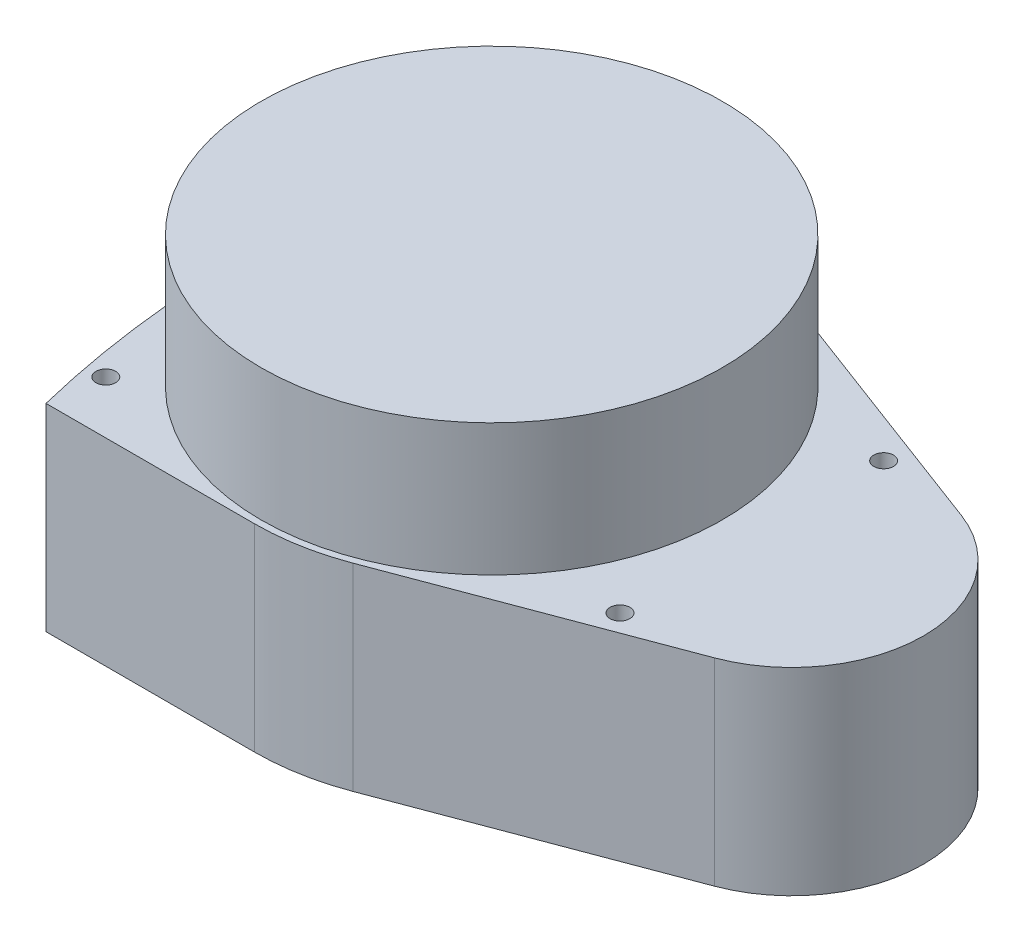
ISO-10303-21;
HEADER;
FILE_DESCRIPTION(('STEP AP214'),'2;1');
FILE_NAME('part.step','',(''),(''),'','','');
FILE_SCHEMA(('AUTOMOTIVE_DESIGN { 1 0 10303 214 1 1 1 1 }'));
ENDSEC;
DATA;
#1=APPLICATION_CONTEXT('core data for automotive mechanical design processes');
#2=APPLICATION_PROTOCOL_DEFINITION('international standard','automotive_design',2000,#1);
#3=PRODUCT_CONTEXT('',#1,'mechanical');
#4=PRODUCT('Part','Part','',(#3));
#5=PRODUCT_RELATED_PRODUCT_CATEGORY('part','',(#4));
#6=PRODUCT_DEFINITION_FORMATION('','',#4);
#7=PRODUCT_DEFINITION_CONTEXT('part definition',#1,'design');
#8=PRODUCT_DEFINITION('design','',#6,#7);
#9=PRODUCT_DEFINITION_SHAPE('','',#8);
#10=(LENGTH_UNIT() NAMED_UNIT(*) SI_UNIT(.MILLI.,.METRE.));
#11=(NAMED_UNIT(*) PLANE_ANGLE_UNIT() SI_UNIT($,.RADIAN.));
#12=(NAMED_UNIT(*) SI_UNIT($,.STERADIAN.) SOLID_ANGLE_UNIT());
#13=UNCERTAINTY_MEASURE_WITH_UNIT(LENGTH_MEASURE(1.E-05),#10,'distance_accuracy_value','');
#14=(GEOMETRIC_REPRESENTATION_CONTEXT(3) GLOBAL_UNCERTAINTY_ASSIGNED_CONTEXT((#13)) GLOBAL_UNIT_ASSIGNED_CONTEXT((#10,
#11,#12)) REPRESENTATION_CONTEXT('',''));
#15=CARTESIAN_POINT('',(0.,0.,0.));
#16=DIRECTION('',(0.,0.,1.));
#17=DIRECTION('',(1.,0.,0.));
#18=AXIS2_PLACEMENT_3D('',#15,#16,#17);
#19=CARTESIAN_POINT('',(0.,20.,0.));
#20=DIRECTION('',(0.,-1.,0.));
#21=DIRECTION('',(0.,0.,-1.));
#22=AXIS2_PLACEMENT_3D('',#19,#20,#21);
#23=CYLINDRICAL_SURFACE('',#22,35.);
#24=CARTESIAN_POINT('',(0.,20.,0.));
#25=DIRECTION('',(0.,1.,0.));
#26=DIRECTION('',(0.,0.,1.));
#27=AXIS2_PLACEMENT_3D('',#24,#25,#26);
#28=CIRCLE('',#27,35.);
#29=CARTESIAN_POINT('',(0.,20.,35.));
#30=VERTEX_POINT('',#29);
#31=EDGE_CURVE('E11',#30,#30,#28,.T.);
#32=ORIENTED_EDGE('',*,*,#31,.F.);
#33=EDGE_LOOP('',(#32));
#34=FACE_BOUND('',#33,.T.);
#35=CARTESIAN_POINT('',(0.,0.,0.));
#36=DIRECTION('',(0.,1.,0.));
#37=DIRECTION('',(0.,0.,1.));
#38=AXIS2_PLACEMENT_3D('',#35,#36,#37);
#39=CIRCLE('',#38,35.);
#40=CARTESIAN_POINT('',(0.,0.,35.));
#41=VERTEX_POINT('',#40);
#42=EDGE_CURVE('E37',#41,#41,#39,.T.);
#43=ORIENTED_EDGE('',*,*,#42,.T.);
#44=EDGE_LOOP('',(#43));
#45=FACE_BOUND('',#44,.T.);
#46=ADVANCED_FACE('F34',(#34,#45),#23,.T.);
#47=CARTESIAN_POINT('',(0.,20.,0.));
#48=DIRECTION('',(0.,1.,0.));
#49=DIRECTION('',(0.,0.,1.));
#50=AXIS2_PLACEMENT_3D('',#47,#48,#49);
#51=PLANE('',#50);
#52=ORIENTED_EDGE('',*,*,#31,.T.);
#53=EDGE_LOOP('',(#52));
#54=FACE_BOUND('',#53,.T.);
#55=ADVANCED_FACE('F229',(#54),#51,.T.);
#56=CARTESIAN_POINT('',(45.5,0.,0.));
#57=DIRECTION('',(0.,1.,0.));
#58=DIRECTION('',(0.,0.,1.));
#59=AXIS2_PLACEMENT_3D('',#56,#57,#58);
#60=PLANE('',#59);
#61=CARTESIAN_POINT('',(39.46,0.,20.));
#62=DIRECTION('',(0.,-1.,0.));
#63=DIRECTION('',(0.,0.,-1.));
#64=AXIS2_PLACEMENT_3D('',#61,#62,#63);
#65=CIRCLE('',#64,1.5);
#66=CARTESIAN_POINT('',(39.46,0.,18.5));
#67=VERTEX_POINT('',#66);
#68=EDGE_CURVE('E203',#67,#67,#65,.T.);
#69=ORIENTED_EDGE('',*,*,#68,.T.);
#70=EDGE_LOOP('',(#69));
#71=FACE_BOUND('',#70,.T.);
#72=CARTESIAN_POINT('',(-30.54,0.,28.));
#73=DIRECTION('',(0.,-1.,0.));
#74=DIRECTION('',(0.,0.,-1.));
#75=AXIS2_PLACEMENT_3D('',#72,#73,#74);
#76=CIRCLE('',#75,1.5);
#77=CARTESIAN_POINT('',(-30.54,0.,26.5));
#78=VERTEX_POINT('',#77);
#79=EDGE_CURVE('E197',#78,#78,#76,.T.);
#80=ORIENTED_EDGE('',*,*,#79,.T.);
#81=EDGE_LOOP('',(#80));
#82=FACE_BOUND('',#81,.T.);
#83=CARTESIAN_POINT('',(39.46,0.,-20.));
#84=DIRECTION('',(0.,1.,0.));
#85=DIRECTION('',(0.,0.,1.));
#86=AXIS2_PLACEMENT_3D('',#83,#84,#85);
#87=CIRCLE('',#86,1.5);
#88=CARTESIAN_POINT('',(39.46,0.,-18.5));
#89=VERTEX_POINT('',#88);
#90=EDGE_CURVE('E191',#89,#89,#87,.T.);
#91=ORIENTED_EDGE('',*,*,#90,.F.);
#92=EDGE_LOOP('',(#91));
#93=FACE_BOUND('',#92,.T.);
#94=CARTESIAN_POINT('',(-30.54,0.,-28.));
#95=DIRECTION('',(0.,1.,0.));
#96=DIRECTION('',(0.,0.,1.));
#97=AXIS2_PLACEMENT_3D('',#94,#95,#96);
#98=CIRCLE('',#97,1.5);
#99=CARTESIAN_POINT('',(-30.54,0.,-26.5));
#100=VERTEX_POINT('',#99);
#101=EDGE_CURVE('E185',#100,#100,#98,.T.);
#102=ORIENTED_EDGE('',*,*,#101,.F.);
#103=EDGE_LOOP('',(#102));
#104=FACE_BOUND('',#103,.T.);
#105=DIRECTION('',(-0.936132168437226,0.,0.351648351648371));
#106=VECTOR('',#105,1.);
#107=CARTESIAN_POINT('',(52.5329670329674,0.,18.7226433687436));
#108=LINE('',#107,#106);
#109=CARTESIAN_POINT('',(52.5329670329674,0.,18.7226433687436));
#110=VERTEX_POINT('',#109);
#111=CARTESIAN_POINT('',(12.6593406593413,0.,33.7007580637401));
#112=VERTEX_POINT('',#111);
#113=EDGE_CURVE('E121',#110,#112,#108,.T.);
#114=ORIENTED_EDGE('',*,*,#113,.F.);
#115=CARTESIAN_POINT('',(45.5,0.,0.));
#116=DIRECTION('',(0.,1.,0.));
#117=DIRECTION('',(0.,0.,1.));
#118=AXIS2_PLACEMENT_3D('',#115,#116,#117);
#119=CIRCLE('',#118,20.);
#120=CARTESIAN_POINT('',(52.532967032967,0.,-18.7226433687447));
#121=VERTEX_POINT('',#120);
#122=EDGE_CURVE('E144',#110,#121,#119,.T.);
#123=ORIENTED_EDGE('',*,*,#122,.T.);
#124=DIRECTION('',(-0.936132168437234,0.,-0.351648351648351));
#125=VECTOR('',#124,1.);
#126=CARTESIAN_POINT('',(52.532967032967,0.,-18.7226433687447));
#127=LINE('',#126,#125);
#128=CARTESIAN_POINT('',(12.6593406593407,0.,-33.7007580637404));
#129=VERTEX_POINT('',#128);
#130=EDGE_CURVE('E147',#121,#129,#127,.T.);
#131=ORIENTED_EDGE('',*,*,#130,.T.);
#132=CARTESIAN_POINT('',(0.,0.,0.));
#133=DIRECTION('',(0.,1.,0.));
#134=DIRECTION('',(0.,0.,1.));
#135=AXIS2_PLACEMENT_3D('',#132,#133,#134);
#136=CIRCLE('',#135,36.);
#137=CARTESIAN_POINT('',(0.,0.,-36.));
#138=VERTEX_POINT('',#137);
#139=EDGE_CURVE('E151',#129,#138,#136,.T.);
#140=ORIENTED_EDGE('',*,*,#139,.T.);
#141=DIRECTION('',(-1.,0.,0.));
#142=VECTOR('',#141,1.);
#143=CARTESIAN_POINT('',(0.,0.,-36.));
#144=LINE('',#143,#142);
#145=CARTESIAN_POINT('',(-31.6159331941392,0.,-36.));
#146=VERTEX_POINT('',#145);
#147=EDGE_CURVE('E154',#138,#146,#144,.T.);
#148=ORIENTED_EDGE('',*,*,#147,.T.);
#149=CARTESIAN_POINT('',(114.,0.,0.));
#150=DIRECTION('',(0.,1.,0.));
#151=DIRECTION('',(0.,0.,1.));
#152=AXIS2_PLACEMENT_3D('',#149,#150,#151);
#153=CIRCLE('',#152,150.);
#154=CARTESIAN_POINT('',(-31.6159331941384,0.,36.0000000000006));
#155=VERTEX_POINT('',#154);
#156=EDGE_CURVE('E139',#146,#155,#153,.T.);
#157=ORIENTED_EDGE('',*,*,#156,.T.);
#158=DIRECTION('',(-1.,0.,0.));
#159=VECTOR('',#158,1.);
#160=CARTESIAN_POINT('',(7.43014747970558E-13,0.,36.));
#161=LINE('',#160,#159);
#162=CARTESIAN_POINT('',(7.47423476447489E-13,0.,36.));
#163=VERTEX_POINT('',#162);
#164=EDGE_CURVE('E126',#163,#155,#161,.T.);
#165=ORIENTED_EDGE('',*,*,#164,.F.);
#166=CARTESIAN_POINT('',(0.,0.,0.));
#167=DIRECTION('',(0.,-1.,0.));
#168=DIRECTION('',(0.,0.,-1.));
#169=AXIS2_PLACEMENT_3D('',#166,#167,#168);
#170=CIRCLE('',#169,36.);
#171=EDGE_CURVE('E172',#112,#163,#170,.T.);
#172=ORIENTED_EDGE('',*,*,#171,.F.);
#173=EDGE_LOOP('',(#114,#123,#131,#140,#148,#157,#165,#172));
#174=FACE_BOUND('',#173,.T.);
#175=ORIENTED_EDGE('',*,*,#42,.F.);
#176=EDGE_LOOP('',(#175));
#177=FACE_BOUND('',#176,.T.);
#178=ADVANCED_FACE('F168',(#71,#82,#93,#104,#174,#177),#60,.T.);
#179=CARTESIAN_POINT('',(45.5,-30.,0.));
#180=DIRECTION('',(0.,1.,0.));
#181=DIRECTION('',(0.,0.,1.));
#182=AXIS2_PLACEMENT_3D('',#179,#180,#181);
#183=CYLINDRICAL_SURFACE('',#182,20.);
#184=ORIENTED_EDGE('',*,*,#122,.F.);
#185=DIRECTION('',(0.,1.,0.));
#186=VECTOR('',#185,1.);
#187=CARTESIAN_POINT('',(52.5329670329674,-30.,18.7226433687436));
#188=LINE('',#187,#186);
#189=CARTESIAN_POINT('',(52.5329670329674,-30.,18.7226433687436));
#190=VERTEX_POINT('',#189);
#191=EDGE_CURVE('E148',#190,#110,#188,.T.);
#192=ORIENTED_EDGE('',*,*,#191,.F.);
#193=CARTESIAN_POINT('',(45.5,-30.,0.));
#194=DIRECTION('',(0.,1.,0.));
#195=DIRECTION('',(0.,0.,1.));
#196=AXIS2_PLACEMENT_3D('',#193,#194,#195);
#197=CIRCLE('',#196,20.);
#198=CARTESIAN_POINT('',(52.532967032967,-30.,-18.7226433687447));
#199=VERTEX_POINT('',#198);
#200=EDGE_CURVE('E135',#190,#199,#197,.T.);
#201=ORIENTED_EDGE('',*,*,#200,.T.);
#202=DIRECTION('',(0.,1.,0.));
#203=VECTOR('',#202,1.);
#204=CARTESIAN_POINT('',(52.532967032967,-30.,-18.7226433687447));
#205=LINE('',#204,#203);
#206=EDGE_CURVE('E78',#199,#121,#205,.T.);
#207=ORIENTED_EDGE('',*,*,#206,.T.);
#208=EDGE_LOOP('',(#184,#192,#201,#207));
#209=FACE_BOUND('',#208,.T.);
#210=ADVANCED_FACE('F163',(#209),#183,.T.);
#211=CARTESIAN_POINT('',(114.,-30.,0.));
#212=DIRECTION('',(0.,1.,0.));
#213=DIRECTION('',(0.,0.,1.));
#214=AXIS2_PLACEMENT_3D('',#211,#212,#213);
#215=CYLINDRICAL_SURFACE('',#214,150.);
#216=ORIENTED_EDGE('',*,*,#156,.F.);
#217=DIRECTION('',(0.,1.,0.));
#218=VECTOR('',#217,1.);
#219=CARTESIAN_POINT('',(-31.6159331941392,-30.,-36.));
#220=LINE('',#219,#218);
#221=CARTESIAN_POINT('',(-31.6159331941392,-30.,-36.));
#222=VERTEX_POINT('',#221);
#223=EDGE_CURVE('E50',#222,#146,#220,.T.);
#224=ORIENTED_EDGE('',*,*,#223,.F.);
#225=CARTESIAN_POINT('',(114.,-30.,0.));
#226=DIRECTION('',(0.,1.,0.));
#227=DIRECTION('',(0.,0.,1.));
#228=AXIS2_PLACEMENT_3D('',#225,#226,#227);
#229=CIRCLE('',#228,150.);
#230=CARTESIAN_POINT('',(-31.6159331941384,-30.,36.0000000000006));
#231=VERTEX_POINT('',#230);
#232=EDGE_CURVE('E104',#222,#231,#229,.T.);
#233=ORIENTED_EDGE('',*,*,#232,.T.);
#234=DIRECTION('',(0.,1.,0.));
#235=VECTOR('',#234,1.);
#236=CARTESIAN_POINT('',(-31.6159331941384,-30.,36.0000000000006));
#237=LINE('',#236,#235);
#238=EDGE_CURVE('E108',#231,#155,#237,.T.);
#239=ORIENTED_EDGE('',*,*,#238,.T.);
#240=EDGE_LOOP('',(#216,#224,#233,#239));
#241=FACE_BOUND('',#240,.T.);
#242=ADVANCED_FACE('F106',(#241),#215,.T.);
#243=CARTESIAN_POINT('',(0.,-30.,-36.));
#244=DIRECTION('',(0.,0.,-1.));
#245=DIRECTION('',(-1.,0.,0.));
#246=AXIS2_PLACEMENT_3D('',#243,#244,#245);
#247=PLANE('',#246);
#248=ORIENTED_EDGE('',*,*,#147,.F.);
#249=DIRECTION('',(0.,1.,0.));
#250=VECTOR('',#249,1.);
#251=CARTESIAN_POINT('',(0.,-30.,-36.));
#252=LINE('',#251,#250);
#253=CARTESIAN_POINT('',(0.,-30.,-36.));
#254=VERTEX_POINT('',#253);
#255=EDGE_CURVE('E68',#254,#138,#252,.T.);
#256=ORIENTED_EDGE('',*,*,#255,.F.);
#257=DIRECTION('',(-1.,0.,0.));
#258=VECTOR('',#257,1.);
#259=CARTESIAN_POINT('',(0.,-30.,-36.));
#260=LINE('',#259,#258);
#261=EDGE_CURVE('E111',#254,#222,#260,.T.);
#262=ORIENTED_EDGE('',*,*,#261,.T.);
#263=ORIENTED_EDGE('',*,*,#223,.T.);
#264=EDGE_LOOP('',(#248,#256,#262,#263));
#265=FACE_BOUND('',#264,.T.);
#266=ADVANCED_FACE('F260',(#265),#247,.T.);
#267=CARTESIAN_POINT('',(0.,-30.,0.));
#268=DIRECTION('',(0.,1.,0.));
#269=DIRECTION('',(0.,0.,1.));
#270=AXIS2_PLACEMENT_3D('',#267,#268,#269);
#271=CYLINDRICAL_SURFACE('',#270,36.);
#272=ORIENTED_EDGE('',*,*,#139,.F.);
#273=DIRECTION('',(0.,1.,0.));
#274=VECTOR('',#273,1.);
#275=CARTESIAN_POINT('',(12.6593406593407,-30.,-33.7007580637404));
#276=LINE('',#275,#274);
#277=CARTESIAN_POINT('',(12.6593406593407,-30.,-33.7007580637404));
#278=VERTEX_POINT('',#277);
#279=EDGE_CURVE('E160',#278,#129,#276,.T.);
#280=ORIENTED_EDGE('',*,*,#279,.F.);
#281=CARTESIAN_POINT('',(0.,-30.,0.));
#282=DIRECTION('',(0.,1.,0.));
#283=DIRECTION('',(0.,0.,1.));
#284=AXIS2_PLACEMENT_3D('',#281,#282,#283);
#285=CIRCLE('',#284,36.);
#286=EDGE_CURVE('E141',#278,#254,#285,.T.);
#287=ORIENTED_EDGE('',*,*,#286,.T.);
#288=ORIENTED_EDGE('',*,*,#255,.T.);
#289=EDGE_LOOP('',(#272,#280,#287,#288));
#290=FACE_BOUND('',#289,.T.);
#291=ADVANCED_FACE('F265',(#290),#271,.T.);
#292=CARTESIAN_POINT('',(52.532967032967,-30.,-18.7226433687447));
#293=DIRECTION('',(0.351648351648351,0.,-0.936132168437234));
#294=DIRECTION('',(-0.936132168437234,0.,-0.351648351648351));
#295=AXIS2_PLACEMENT_3D('',#292,#293,#294);
#296=PLANE('',#295);
#297=ORIENTED_EDGE('',*,*,#130,.F.);
#298=ORIENTED_EDGE('',*,*,#206,.F.);
#299=DIRECTION('',(-0.936132168437234,0.,-0.351648351648351));
#300=VECTOR('',#299,1.);
#301=CARTESIAN_POINT('',(52.532967032967,-30.,-18.7226433687447));
#302=LINE('',#301,#300);
#303=EDGE_CURVE('E138',#199,#278,#302,.T.);
#304=ORIENTED_EDGE('',*,*,#303,.T.);
#305=ORIENTED_EDGE('',*,*,#279,.T.);
#306=EDGE_LOOP('',(#297,#298,#304,#305));
#307=FACE_BOUND('',#306,.T.);
#308=ADVANCED_FACE('F166',(#307),#296,.T.);
#309=CARTESIAN_POINT('',(45.5,-30.,0.));
#310=DIRECTION('',(0.,1.,0.));
#311=DIRECTION('',(0.,0.,1.));
#312=AXIS2_PLACEMENT_3D('',#309,#310,#311);
#313=PLANE('',#312);
#314=CARTESIAN_POINT('',(39.46,-30.,20.));
#315=DIRECTION('',(0.,-1.,0.));
#316=DIRECTION('',(0.,0.,-1.));
#317=AXIS2_PLACEMENT_3D('',#314,#315,#316);
#318=CIRCLE('',#317,1.5);
#319=CARTESIAN_POINT('',(39.46,-30.,18.5));
#320=VERTEX_POINT('',#319);
#321=EDGE_CURVE('E200',#320,#320,#318,.T.);
#322=ORIENTED_EDGE('',*,*,#321,.F.);
#323=EDGE_LOOP('',(#322));
#324=FACE_BOUND('',#323,.T.);
#325=CARTESIAN_POINT('',(-30.54,-30.,28.));
#326=DIRECTION('',(0.,-1.,0.));
#327=DIRECTION('',(0.,0.,-1.));
#328=AXIS2_PLACEMENT_3D('',#325,#326,#327);
#329=CIRCLE('',#328,1.5);
#330=CARTESIAN_POINT('',(-30.54,-30.,26.5));
#331=VERTEX_POINT('',#330);
#332=EDGE_CURVE('E194',#331,#331,#329,.T.);
#333=ORIENTED_EDGE('',*,*,#332,.F.);
#334=EDGE_LOOP('',(#333));
#335=FACE_BOUND('',#334,.T.);
#336=CARTESIAN_POINT('',(39.46,-30.,-20.));
#337=DIRECTION('',(0.,1.,0.));
#338=DIRECTION('',(0.,0.,1.));
#339=AXIS2_PLACEMENT_3D('',#336,#337,#338);
#340=CIRCLE('',#339,1.5);
#341=CARTESIAN_POINT('',(39.46,-30.,-18.5));
#342=VERTEX_POINT('',#341);
#343=EDGE_CURVE('E188',#342,#342,#340,.T.);
#344=ORIENTED_EDGE('',*,*,#343,.T.);
#345=EDGE_LOOP('',(#344));
#346=FACE_BOUND('',#345,.T.);
#347=CARTESIAN_POINT('',(-30.54,-30.,-28.));
#348=DIRECTION('',(0.,1.,0.));
#349=DIRECTION('',(0.,0.,1.));
#350=AXIS2_PLACEMENT_3D('',#347,#348,#349);
#351=CIRCLE('',#350,1.5);
#352=CARTESIAN_POINT('',(-30.54,-30.,-26.5));
#353=VERTEX_POINT('',#352);
#354=EDGE_CURVE('E182',#353,#353,#351,.T.);
#355=ORIENTED_EDGE('',*,*,#354,.T.);
#356=EDGE_LOOP('',(#355));
#357=FACE_BOUND('',#356,.T.);
#358=ORIENTED_EDGE('',*,*,#200,.F.);
#359=DIRECTION('',(-0.936132168437226,0.,0.351648351648371));
#360=VECTOR('',#359,1.);
#361=CARTESIAN_POINT('',(52.5329670329674,-30.,18.7226433687436));
#362=LINE('',#361,#360);
#363=CARTESIAN_POINT('',(12.6593406593413,-30.,33.7007580637401));
#364=VERTEX_POINT('',#363);
#365=EDGE_CURVE('E128',#190,#364,#362,.T.);
#366=ORIENTED_EDGE('',*,*,#365,.T.);
#367=CARTESIAN_POINT('',(0.,-30.,0.));
#368=DIRECTION('',(0.,-1.,0.));
#369=DIRECTION('',(0.,0.,-1.));
#370=AXIS2_PLACEMENT_3D('',#367,#368,#369);
#371=CIRCLE('',#370,36.);
#372=CARTESIAN_POINT('',(7.47423476447489E-13,-30.,36.));
#373=VERTEX_POINT('',#372);
#374=EDGE_CURVE('E117',#364,#373,#371,.T.);
#375=ORIENTED_EDGE('',*,*,#374,.T.);
#376=DIRECTION('',(-1.,0.,0.));
#377=VECTOR('',#376,1.);
#378=CARTESIAN_POINT('',(7.43014747970558E-13,-30.,36.));
#379=LINE('',#378,#377);
#380=EDGE_CURVE('E114',#373,#231,#379,.T.);
#381=ORIENTED_EDGE('',*,*,#380,.T.);
#382=ORIENTED_EDGE('',*,*,#232,.F.);
#383=ORIENTED_EDGE('',*,*,#261,.F.);
#384=ORIENTED_EDGE('',*,*,#286,.F.);
#385=ORIENTED_EDGE('',*,*,#303,.F.);
#386=EDGE_LOOP('',(#358,#366,#375,#381,#382,#383,#384,#385));
#387=FACE_BOUND('',#386,.T.);
#388=ADVANCED_FACE('F115',(#324,#335,#346,#357,#387),#313,.F.);
#389=CARTESIAN_POINT('',(52.5329670329674,-30.,18.7226433687436));
#390=DIRECTION('',(-0.351648351648371,0.,-0.936132168437227));
#391=DIRECTION('',(-0.936132168437227,0.,0.351648351648371));
#392=AXIS2_PLACEMENT_3D('',#389,#390,#391);
#393=PLANE('',#392);
#394=ORIENTED_EDGE('',*,*,#113,.T.);
#395=DIRECTION('',(0.,1.,0.));
#396=VECTOR('',#395,1.);
#397=CARTESIAN_POINT('',(12.6593406593413,-30.,33.7007580637401));
#398=LINE('',#397,#396);
#399=EDGE_CURVE('E130',#364,#112,#398,.T.);
#400=ORIENTED_EDGE('',*,*,#399,.F.);
#401=ORIENTED_EDGE('',*,*,#365,.F.);
#402=ORIENTED_EDGE('',*,*,#191,.T.);
#403=EDGE_LOOP('',(#394,#400,#401,#402));
#404=FACE_BOUND('',#403,.T.);
#405=ADVANCED_FACE('F178',(#404),#393,.F.);
#406=CARTESIAN_POINT('',(0.,-30.,0.));
#407=DIRECTION('',(0.,1.,0.));
#408=DIRECTION('',(0.,0.,1.));
#409=AXIS2_PLACEMENT_3D('',#406,#407,#408);
#410=CYLINDRICAL_SURFACE('',#409,36.);
#411=ORIENTED_EDGE('',*,*,#171,.T.);
#412=DIRECTION('',(0.,1.,0.));
#413=VECTOR('',#412,1.);
#414=CARTESIAN_POINT('',(7.47423476447489E-13,-30.,36.));
#415=LINE('',#414,#413);
#416=EDGE_CURVE('E127',#373,#163,#415,.T.);
#417=ORIENTED_EDGE('',*,*,#416,.F.);
#418=ORIENTED_EDGE('',*,*,#374,.F.);
#419=ORIENTED_EDGE('',*,*,#399,.T.);
#420=EDGE_LOOP('',(#411,#417,#418,#419));
#421=FACE_BOUND('',#420,.T.);
#422=ADVANCED_FACE('F296',(#421),#410,.T.);
#423=CARTESIAN_POINT('',(7.43014747970558E-13,-30.,36.));
#424=DIRECTION('',(0.,0.,-1.));
#425=DIRECTION('',(-1.,0.,0.));
#426=AXIS2_PLACEMENT_3D('',#423,#424,#425);
#427=PLANE('',#426);
#428=ORIENTED_EDGE('',*,*,#164,.T.);
#429=ORIENTED_EDGE('',*,*,#238,.F.);
#430=ORIENTED_EDGE('',*,*,#380,.F.);
#431=ORIENTED_EDGE('',*,*,#416,.T.);
#432=EDGE_LOOP('',(#428,#429,#430,#431));
#433=FACE_BOUND('',#432,.T.);
#434=ADVANCED_FACE('F124',(#433),#427,.F.);
#435=CARTESIAN_POINT('',(-30.54,-30.,-28.));
#436=DIRECTION('',(0.,1.,0.));
#437=DIRECTION('',(0.,0.,1.));
#438=AXIS2_PLACEMENT_3D('',#435,#436,#437);
#439=CYLINDRICAL_SURFACE('',#438,1.5);
#440=ORIENTED_EDGE('',*,*,#354,.F.);
#441=EDGE_LOOP('',(#440));
#442=FACE_BOUND('',#441,.T.);
#443=ORIENTED_EDGE('',*,*,#101,.T.);
#444=EDGE_LOOP('',(#443));
#445=FACE_BOUND('',#444,.T.);
#446=ADVANCED_FACE('F221',(#442,#445),#439,.F.);
#447=CARTESIAN_POINT('',(39.46,-30.,-20.));
#448=DIRECTION('',(0.,1.,0.));
#449=DIRECTION('',(0.,0.,1.));
#450=AXIS2_PLACEMENT_3D('',#447,#448,#449);
#451=CYLINDRICAL_SURFACE('',#450,1.5);
#452=ORIENTED_EDGE('',*,*,#343,.F.);
#453=EDGE_LOOP('',(#452));
#454=FACE_BOUND('',#453,.T.);
#455=ORIENTED_EDGE('',*,*,#90,.T.);
#456=EDGE_LOOP('',(#455));
#457=FACE_BOUND('',#456,.T.);
#458=ADVANCED_FACE('F224',(#454,#457),#451,.F.);
#459=CARTESIAN_POINT('',(-30.54,-30.,28.));
#460=DIRECTION('',(0.,1.,0.));
#461=DIRECTION('',(0.,0.,1.));
#462=AXIS2_PLACEMENT_3D('',#459,#460,#461);
#463=CYLINDRICAL_SURFACE('',#462,1.5);
#464=ORIENTED_EDGE('',*,*,#332,.T.);
#465=EDGE_LOOP('',(#464));
#466=FACE_BOUND('',#465,.T.);
#467=ORIENTED_EDGE('',*,*,#79,.F.);
#468=EDGE_LOOP('',(#467));
#469=FACE_BOUND('',#468,.T.);
#470=ADVANCED_FACE('F321',(#466,#469),#463,.F.);
#471=CARTESIAN_POINT('',(39.46,-30.,20.));
#472=DIRECTION('',(0.,1.,0.));
#473=DIRECTION('',(0.,0.,1.));
#474=AXIS2_PLACEMENT_3D('',#471,#472,#473);
#475=CYLINDRICAL_SURFACE('',#474,1.5);
#476=ORIENTED_EDGE('',*,*,#321,.T.);
#477=EDGE_LOOP('',(#476));
#478=FACE_BOUND('',#477,.T.);
#479=ORIENTED_EDGE('',*,*,#68,.F.);
#480=EDGE_LOOP('',(#479));
#481=FACE_BOUND('',#480,.T.);
#482=ADVANCED_FACE('F209',(#478,#481),#475,.F.);
#483=CLOSED_SHELL('',(#46,#55,#178,#210,#242,#266,#291,#308,#388,#405,#422,#434,#446,#458,#470,#482));
#484=MANIFOLD_SOLID_BREP('B2',#483);
#485=ADVANCED_BREP_SHAPE_REPRESENTATION('',(#18,#484),#14);
#486=SHAPE_DEFINITION_REPRESENTATION(#9,#485);
ENDSEC;
END-ISO-10303-21;
